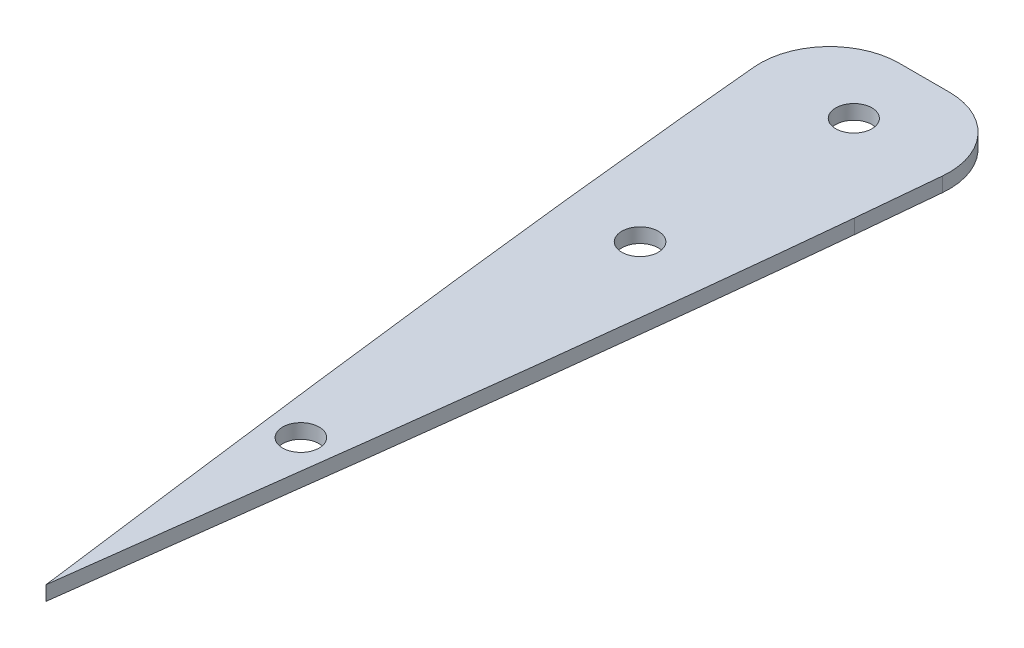
ISO-10303-21;
HEADER;
FILE_DESCRIPTION(('STEP AP214'),'2;1');
FILE_NAME('part.step','',(''),(''),'','','');
FILE_SCHEMA(('AUTOMOTIVE_DESIGN { 1 0 10303 214 1 1 1 1 }'));
ENDSEC;
DATA;
#1=APPLICATION_CONTEXT('core data for automotive mechanical design processes');
#2=APPLICATION_PROTOCOL_DEFINITION('international standard','automotive_design',2000,#1);
#3=PRODUCT_CONTEXT('',#1,'mechanical');
#4=PRODUCT('Part','Part','',(#3));
#5=PRODUCT_RELATED_PRODUCT_CATEGORY('part','',(#4));
#6=PRODUCT_DEFINITION_FORMATION('','',#4);
#7=PRODUCT_DEFINITION_CONTEXT('part definition',#1,'design');
#8=PRODUCT_DEFINITION('design','',#6,#7);
#9=PRODUCT_DEFINITION_SHAPE('','',#8);
#10=(LENGTH_UNIT() NAMED_UNIT(*) SI_UNIT(.MILLI.,.METRE.));
#11=(NAMED_UNIT(*) PLANE_ANGLE_UNIT() SI_UNIT($,.RADIAN.));
#12=(NAMED_UNIT(*) SI_UNIT($,.STERADIAN.) SOLID_ANGLE_UNIT());
#13=UNCERTAINTY_MEASURE_WITH_UNIT(LENGTH_MEASURE(1.E-05),#10,'distance_accuracy_value','');
#14=(GEOMETRIC_REPRESENTATION_CONTEXT(3) GLOBAL_UNCERTAINTY_ASSIGNED_CONTEXT((#13)) GLOBAL_UNIT_ASSIGNED_CONTEXT((#10,
#11,#12)) REPRESENTATION_CONTEXT('',''));
#15=CARTESIAN_POINT('',(0.,0.,0.));
#16=DIRECTION('',(0.,0.,1.));
#17=DIRECTION('',(1.,0.,0.));
#18=AXIS2_PLACEMENT_3D('',#15,#16,#17);
#19=CARTESIAN_POINT('',(1.10809611059364,169.87266,71.9337783562964));
#20=DIRECTION('',(0.,-1.,0.));
#21=DIRECTION('',(0.,0.,-1.));
#22=AXIS2_PLACEMENT_3D('',#19,#20,#21);
#23=CYLINDRICAL_SURFACE('',#22,2.);
#24=CARTESIAN_POINT('',(1.10809611059364,127.918597709814,71.9337783562964));
#25=DIRECTION('',(0.,1.,0.));
#26=DIRECTION('',(0.,0.,1.));
#27=AXIS2_PLACEMENT_3D('',#24,#25,#26);
#28=CIRCLE('',#27,2.);
#29=CARTESIAN_POINT('',(1.10809611059364,127.918597709814,73.9337783562964));
#30=VERTEX_POINT('',#29);
#31=EDGE_CURVE('E43',#30,#30,#28,.F.);
#32=ORIENTED_EDGE('',*,*,#31,.T.);
#33=EDGE_LOOP('',(#32));
#34=FACE_BOUND('',#33,.T.);
#35=CARTESIAN_POINT('',(1.10809611059364,129.506097709814,71.9337783562964));
#36=DIRECTION('',(0.,-1.,0.));
#37=DIRECTION('',(0.,0.,-1.));
#38=AXIS2_PLACEMENT_3D('',#35,#36,#37);
#39=CIRCLE('',#38,2.);
#40=CARTESIAN_POINT('',(1.10809611059364,129.506097709814,69.9337783562964));
#41=VERTEX_POINT('',#40);
#42=EDGE_CURVE('E131',#41,#41,#39,.F.);
#43=ORIENTED_EDGE('',*,*,#42,.T.);
#44=EDGE_LOOP('',(#43));
#45=FACE_BOUND('',#44,.T.);
#46=ADVANCED_FACE('F39',(#34,#45),#23,.F.);
#47=CARTESIAN_POINT('',(-9.25951888196291,129.506097709814,99.8737783562964));
#48=DIRECTION('',(0.,-1.,0.));
#49=DIRECTION('',(0.,0.,-1.));
#50=AXIS2_PLACEMENT_3D('',#47,#48,#49);
#51=PLANE('',#50);
#52=CARTESIAN_POINT('',(1.10810856874065,129.506097709814,11.326456678177));
#53=DIRECTION('',(0.,-1.,0.));
#54=DIRECTION('',(0.,0.,-1.));
#55=AXIS2_PLACEMENT_3D('',#52,#53,#54);
#56=CIRCLE('',#55,1.984375);
#57=CARTESIAN_POINT('',(1.10810856874065,129.506097709814,9.342081678177));
#58=VERTEX_POINT('',#57);
#59=EDGE_CURVE('E120',#58,#58,#56,.T.);
#60=ORIENTED_EDGE('',*,*,#59,.T.);
#61=EDGE_LOOP('',(#60));
#62=FACE_BOUND('',#61,.T.);
#63=CARTESIAN_POINT('',(-1.63951888196291,129.506097709814,11.2274515728352));
#64=DIRECTION('',(0.,-1.,0.));
#65=DIRECTION('',(0.,0.,-1.));
#66=AXIS2_PLACEMENT_3D('',#63,#64,#65);
#67=CIRCLE('',#66,7.62);
#68=CARTESIAN_POINT('',(-1.63951888196291,129.506097709814,3.60745157283523));
#69=VERTEX_POINT('',#68);
#70=CARTESIAN_POINT('',(-9.22789688315304,129.506097709814,11.9209350341043));
#71=VERTEX_POINT('',#70);
#72=EDGE_CURVE('E105',#69,#71,#67,.F.);
#73=ORIENTED_EDGE('',*,*,#72,.T.);
#74=CARTESIAN_POINT('',(-9.95528734648911,129.506097709814,3.60745157283523));
#75=CARTESIAN_POINT('',(-9.89780564985952,129.506097709814,4.29681695227936));
#76=CARTESIAN_POINT('',(-9.41437139557562,129.506097709814,10.0160031655518));
#77=CARTESIAN_POINT('',(-8.88377675291906,129.506097709814,15.7302015711882));
#78=CARTESIAN_POINT('',(-8.38670742850917,129.506097709814,20.7524515728352));
#79=B_SPLINE_CURVE_WITH_KNOTS('',3,(#74,#75,#76,#77,#78),.UNSPECIFIED.,.F.,.F.,(4,1,4),
(0.384969625903912,0.394992547848154,0.46813159331185),.UNSPECIFIED.);
#80=CARTESIAN_POINT('',(-8.38670742850917,129.506097709814,20.7524515728352));
#81=VERTEX_POINT('',#80);
#82=EDGE_CURVE('E121',#81,#71,#79,.F.);
#83=ORIENTED_EDGE('',*,*,#82,.F.);
#84=CARTESIAN_POINT('',(-8.38670742850917,129.506097709814,20.7524515728352));
#85=CARTESIAN_POINT('',(-5.77036767929202,129.506097709814,47.1872196515421));
#86=CARTESIAN_POINT('',(-2.31115252231645,129.506097709814,73.5317641629202));
#87=CARTESIAN_POINT('',(1.10809611059364,129.506097709814,99.8737783562964));
#88=B_SPLINE_CURVE_WITH_KNOTS('',3,(#84,#85,#86,#87),.UNSPECIFIED.,.F.,.F.,(4,4),(0.,
0.384969625903912),.UNSPECIFIED.);
#89=CARTESIAN_POINT('',(1.10809611059364,129.506097709814,99.8737783562964));
#90=VERTEX_POINT('',#89);
#91=EDGE_CURVE('E161',#90,#81,#88,.F.);
#92=ORIENTED_EDGE('',*,*,#91,.F.);
#93=CARTESIAN_POINT('',(1.10809611059364,129.506097709814,99.8737783562964));
#94=CARTESIAN_POINT('',(4.527344743513,129.506097709814,73.5317641629181));
#95=CARTESIAN_POINT('',(7.98655990047842,129.506097709814,47.1872196515431));
#96=CARTESIAN_POINT('',(10.6028996496958,129.506097709814,20.7524515728353));
#97=B_SPLINE_CURVE_WITH_KNOTS('',3,(#93,#94,#95,#96),.UNSPECIFIED.,.F.,.F.,(4,4),(0.,
0.384969625903911),.UNSPECIFIED.);
#98=CARTESIAN_POINT('',(10.6028996496958,129.506097709814,20.7524515728353));
#99=VERTEX_POINT('',#98);
#100=EDGE_CURVE('E152',#99,#90,#97,.F.);
#101=ORIENTED_EDGE('',*,*,#100,.F.);
#102=CARTESIAN_POINT('',(10.6028996496958,129.506097709814,20.7524515728353));
#103=CARTESIAN_POINT('',(11.0999689741058,129.506097709814,15.7302015711881));
#104=CARTESIAN_POINT('',(11.6305636167611,129.506097709814,10.0160031655713));
#105=CARTESIAN_POINT('',(12.113997871047,129.506097709814,4.29681695227809));
#106=CARTESIAN_POINT('',(12.1714795676765,129.506097709814,3.60745157283523));
#107=B_SPLINE_CURVE_WITH_KNOTS('',3,(#102,#103,#104,#105,#106),.UNSPECIFIED.,.F.,.F.,(4,1,4),
(0.384969625903911,0.458108671367609,0.468131593311824),.UNSPECIFIED.);
#108=CARTESIAN_POINT('',(11.4440891043401,129.506097709814,11.9209350341047));
#109=VERTEX_POINT('',#108);
#110=EDGE_CURVE('E146',#109,#99,#107,.F.);
#111=ORIENTED_EDGE('',*,*,#110,.F.);
#112=CARTESIAN_POINT('',(3.85571110314996,129.506097709814,11.2274515728352));
#113=DIRECTION('',(0.,-1.,0.));
#114=DIRECTION('',(0.,0.,-1.));
#115=AXIS2_PLACEMENT_3D('',#112,#113,#114);
#116=CIRCLE('',#115,7.62);
#117=CARTESIAN_POINT('',(3.85571110314996,129.506097709814,3.60745157283523));
#118=VERTEX_POINT('',#117);
#119=EDGE_CURVE('E108',#109,#118,#116,.F.);
#120=ORIENTED_EDGE('',*,*,#119,.T.);
#121=DIRECTION('',(1.,0.,0.));
#122=VECTOR('',#121,1.);
#123=CARTESIAN_POINT('',(-9.25951888196291,129.506097709814,3.60745157283523));
#124=LINE('',#123,#122);
#125=EDGE_CURVE('E101',#69,#118,#124,.T.);
#126=ORIENTED_EDGE('',*,*,#125,.F.);
#127=EDGE_LOOP('',(#73,#83,#92,#101,#111,#120,#126));
#128=FACE_BOUND('',#127,.T.);
#129=ORIENTED_EDGE('',*,*,#42,.F.);
#130=EDGE_LOOP('',(#129));
#131=FACE_BOUND('',#130,.T.);
#132=CARTESIAN_POINT('',(1.10809611059353,129.506097709814,34.7605521374388));
#133=DIRECTION('',(0.,-1.,0.));
#134=DIRECTION('',(0.,0.,-1.));
#135=AXIS2_PLACEMENT_3D('',#132,#133,#134);
#136=CIRCLE('',#135,2.);
#137=CARTESIAN_POINT('',(1.10809611059353,129.506097709814,32.7605521374388));
#138=VERTEX_POINT('',#137);
#139=EDGE_CURVE('E134',#138,#138,#136,.F.);
#140=ORIENTED_EDGE('',*,*,#139,.F.);
#141=EDGE_LOOP('',(#140));
#142=FACE_BOUND('',#141,.T.);
#143=ADVANCED_FACE('F103',(#62,#128,#131,#142),#51,.F.);
#144=CARTESIAN_POINT('',(-9.25951888196291,127.918597709814,99.8737783562964));
#145=DIRECTION('',(0.,1.,0.));
#146=DIRECTION('',(0.,0.,1.));
#147=AXIS2_PLACEMENT_3D('',#144,#145,#146);
#148=PLANE('',#147);
#149=CARTESIAN_POINT('',(1.10810856874065,127.918597709814,11.326456678177));
#150=DIRECTION('',(0.,1.,0.));
#151=DIRECTION('',(0.,0.,1.));
#152=AXIS2_PLACEMENT_3D('',#149,#150,#151);
#153=CIRCLE('',#152,1.984375);
#154=CARTESIAN_POINT('',(1.10810856874065,127.918597709814,13.310831678177));
#155=VERTEX_POINT('',#154);
#156=EDGE_CURVE('E225',#155,#155,#153,.T.);
#157=ORIENTED_EDGE('',*,*,#156,.T.);
#158=EDGE_LOOP('',(#157));
#159=FACE_BOUND('',#158,.T.);
#160=CARTESIAN_POINT('',(-1.63951888196291,127.918597709814,11.2274515728352));
#161=DIRECTION('',(0.,1.,0.));
#162=DIRECTION('',(0.,0.,1.));
#163=AXIS2_PLACEMENT_3D('',#160,#161,#162);
#164=CIRCLE('',#163,7.62);
#165=CARTESIAN_POINT('',(-9.22789688315304,127.918597709814,11.9209350341043));
#166=VERTEX_POINT('',#165);
#167=CARTESIAN_POINT('',(-1.63951888196291,127.918597709814,3.60745157283523));
#168=VERTEX_POINT('',#167);
#169=EDGE_CURVE('E57',#166,#168,#164,.F.);
#170=ORIENTED_EDGE('',*,*,#169,.T.);
#171=DIRECTION('',(1.,0.,0.));
#172=VECTOR('',#171,1.);
#173=CARTESIAN_POINT('',(-9.25951888196291,127.918597709814,3.60745157283523));
#174=LINE('',#173,#172);
#175=CARTESIAN_POINT('',(3.85571110314996,127.918597709814,3.60745157283523));
#176=VERTEX_POINT('',#175);
#177=EDGE_CURVE('E114',#168,#176,#174,.T.);
#178=ORIENTED_EDGE('',*,*,#177,.T.);
#179=CARTESIAN_POINT('',(3.85571110314996,127.918597709814,11.2274515728352));
#180=DIRECTION('',(0.,1.,0.));
#181=DIRECTION('',(0.,0.,1.));
#182=AXIS2_PLACEMENT_3D('',#179,#180,#181);
#183=CIRCLE('',#182,7.62);
#184=CARTESIAN_POINT('',(11.4440891043401,127.918597709814,11.9209350341047));
#185=VERTEX_POINT('',#184);
#186=EDGE_CURVE('E187',#176,#185,#183,.F.);
#187=ORIENTED_EDGE('',*,*,#186,.T.);
#188=CARTESIAN_POINT('',(10.6028996496958,127.918597709814,20.7524515728353));
#189=CARTESIAN_POINT('',(11.0999689741058,127.918597709814,15.7302015711881));
#190=CARTESIAN_POINT('',(11.6305636167611,127.918597709814,10.0160031655713));
#191=CARTESIAN_POINT('',(12.113997871047,127.918597709814,4.29681695227809));
#192=CARTESIAN_POINT('',(12.1714795676765,127.918597709814,3.60745157283523));
#193=B_SPLINE_CURVE_WITH_KNOTS('',3,(#188,#189,#190,#191,#192),.UNSPECIFIED.,.F.,.F.,(4,1,4),
(0.384969625903911,0.458108671367609,0.468131593311824),.UNSPECIFIED.);
#194=CARTESIAN_POINT('',(10.6028996496958,127.918597709814,20.7524515728353));
#195=VERTEX_POINT('',#194);
#196=EDGE_CURVE('E190',#195,#185,#193,.T.);
#197=ORIENTED_EDGE('',*,*,#196,.F.);
#198=CARTESIAN_POINT('',(1.10809611059364,127.918597709814,99.8737783562964));
#199=CARTESIAN_POINT('',(4.527344743513,127.918597709814,73.5317641629181));
#200=CARTESIAN_POINT('',(7.98655990047842,127.918597709814,47.1872196515431));
#201=CARTESIAN_POINT('',(10.6028996496958,127.918597709814,20.7524515728353));
#202=B_SPLINE_CURVE_WITH_KNOTS('',3,(#198,#199,#200,#201),.UNSPECIFIED.,.F.,.F.,(4,4),(0.,
0.384969625903911),.UNSPECIFIED.);
#203=CARTESIAN_POINT('',(1.10809611059364,127.918597709814,99.8737783562964));
#204=VERTEX_POINT('',#203);
#205=EDGE_CURVE('E196',#204,#195,#202,.T.);
#206=ORIENTED_EDGE('',*,*,#205,.F.);
#207=CARTESIAN_POINT('',(-8.38670742850917,127.918597709814,20.7524515728352));
#208=CARTESIAN_POINT('',(-5.77036767929202,127.918597709814,47.1872196515421));
#209=CARTESIAN_POINT('',(-2.31115252231645,127.918597709814,73.5317641629202));
#210=CARTESIAN_POINT('',(1.10809611059364,127.918597709814,99.8737783562964));
#211=B_SPLINE_CURVE_WITH_KNOTS('',3,(#207,#208,#209,#210),.UNSPECIFIED.,.F.,.F.,(4,4),(0.,
0.384969625903912),.UNSPECIFIED.);
#212=CARTESIAN_POINT('',(-8.38670742850917,127.918597709814,20.7524515728352));
#213=VERTEX_POINT('',#212);
#214=EDGE_CURVE('E64',#213,#204,#211,.T.);
#215=ORIENTED_EDGE('',*,*,#214,.F.);
#216=CARTESIAN_POINT('',(-9.95528734648911,127.918597709814,3.60745157283523));
#217=CARTESIAN_POINT('',(-9.89780564985952,127.918597709814,4.29681695227936));
#218=CARTESIAN_POINT('',(-9.41437139557562,127.918597709814,10.0160031655518));
#219=CARTESIAN_POINT('',(-8.88377675291906,127.918597709814,15.7302015711882));
#220=CARTESIAN_POINT('',(-8.38670742850917,127.918597709814,20.7524515728352));
#221=B_SPLINE_CURVE_WITH_KNOTS('',3,(#216,#217,#218,#219,#220),.UNSPECIFIED.,.F.,.F.,(4,1,4),
(0.384969625903912,0.394992547848154,0.46813159331185),.UNSPECIFIED.);
#222=EDGE_CURVE('E212',#166,#213,#221,.T.);
#223=ORIENTED_EDGE('',*,*,#222,.F.);
#224=EDGE_LOOP('',(#170,#178,#187,#197,#206,#215,#223));
#225=FACE_BOUND('',#224,.T.);
#226=ORIENTED_EDGE('',*,*,#31,.F.);
#227=EDGE_LOOP('',(#226));
#228=FACE_BOUND('',#227,.T.);
#229=CARTESIAN_POINT('',(1.10809611059353,127.918597709814,34.7605521374388));
#230=DIRECTION('',(0.,1.,0.));
#231=DIRECTION('',(0.,0.,1.));
#232=AXIS2_PLACEMENT_3D('',#229,#230,#231);
#233=CIRCLE('',#232,2.);
#234=CARTESIAN_POINT('',(1.10809611059353,127.918597709814,36.7605521374388));
#235=VERTEX_POINT('',#234);
#236=EDGE_CURVE('E183',#235,#235,#233,.F.);
#237=ORIENTED_EDGE('',*,*,#236,.F.);
#238=EDGE_LOOP('',(#237));
#239=FACE_BOUND('',#238,.T.);
#240=ADVANCED_FACE('F261',(#159,#225,#228,#239),#148,.F.);
#241=CARTESIAN_POINT('',(1.10809611059353,169.87266,34.7605521374388));
#242=DIRECTION('',(0.,-1.,0.));
#243=DIRECTION('',(0.,0.,-1.));
#244=AXIS2_PLACEMENT_3D('',#241,#242,#243);
#245=CYLINDRICAL_SURFACE('',#244,2.);
#246=ORIENTED_EDGE('',*,*,#236,.T.);
#247=EDGE_LOOP('',(#246));
#248=FACE_BOUND('',#247,.T.);
#249=ORIENTED_EDGE('',*,*,#139,.T.);
#250=EDGE_LOOP('',(#249));
#251=FACE_BOUND('',#250,.T.);
#252=ADVANCED_FACE('F267',(#248,#251),#245,.F.);
#253=CARTESIAN_POINT('',(1.10809611059364,169.87266,99.8737783562964));
#254=CARTESIAN_POINT('',(4.527344743513,169.87266,73.5317641629181));
#255=CARTESIAN_POINT('',(7.98655990047842,169.87266,47.1872196515431));
#256=CARTESIAN_POINT('',(10.6028996496958,169.87266,20.7524515728353));
#257=B_SPLINE_CURVE_WITH_KNOTS('',3,(#253,#254,#255,#256),.UNSPECIFIED.,.F.,.F.,(4,4),(0.,
0.384969625903911),.UNSPECIFIED.);
#258=DIRECTION('',(0.,-1.,0.));
#259=VECTOR('',#258,1.);
#260=SURFACE_OF_LINEAR_EXTRUSION('',#257,#259);
#261=DIRECTION('',(0.,-1.,0.));
#262=VECTOR('',#261,1.);
#263=CARTESIAN_POINT('',(1.10809611059364,169.87266,99.8737783562964));
#264=LINE('',#263,#262);
#265=EDGE_CURVE('E294',#90,#204,#264,.T.);
#266=ORIENTED_EDGE('',*,*,#265,.T.);
#267=ORIENTED_EDGE('',*,*,#205,.T.);
#268=DIRECTION('',(0.,-1.,0.));
#269=VECTOR('',#268,1.);
#270=CARTESIAN_POINT('',(10.6028996496958,169.87266,20.7524515728353));
#271=LINE('',#270,#269);
#272=EDGE_CURVE('E290',#99,#195,#271,.T.);
#273=ORIENTED_EDGE('',*,*,#272,.F.);
#274=ORIENTED_EDGE('',*,*,#100,.T.);
#275=EDGE_LOOP('',(#266,#267,#273,#274));
#276=FACE_BOUND('',#275,.T.);
#277=ADVANCED_FACE('F245',(#276),#260,.F.);
#278=CARTESIAN_POINT('',(-8.38670742850917,169.87266,20.7524515728352));
#279=CARTESIAN_POINT('',(-5.77036767929202,169.87266,47.1872196515421));
#280=CARTESIAN_POINT('',(-2.31115252231645,169.87266,73.5317641629202));
#281=CARTESIAN_POINT('',(1.10809611059364,169.87266,99.8737783562964));
#282=B_SPLINE_CURVE_WITH_KNOTS('',3,(#278,#279,#280,#281),.UNSPECIFIED.,.F.,.F.,(4,4),(0.,
0.384969625903912),.UNSPECIFIED.);
#283=DIRECTION('',(0.,-1.,0.));
#284=VECTOR('',#283,1.);
#285=SURFACE_OF_LINEAR_EXTRUSION('',#282,#284);
#286=DIRECTION('',(0.,-1.,0.));
#287=VECTOR('',#286,1.);
#288=CARTESIAN_POINT('',(-8.38670742850917,169.87266,20.7524515728352));
#289=LINE('',#288,#287);
#290=EDGE_CURVE('E229',#81,#213,#289,.T.);
#291=ORIENTED_EDGE('',*,*,#290,.T.);
#292=ORIENTED_EDGE('',*,*,#214,.T.);
#293=ORIENTED_EDGE('',*,*,#265,.F.);
#294=ORIENTED_EDGE('',*,*,#91,.T.);
#295=EDGE_LOOP('',(#291,#292,#293,#294));
#296=FACE_BOUND('',#295,.T.);
#297=ADVANCED_FACE('F242',(#296),#285,.F.);
#298=CARTESIAN_POINT('',(-1.63951888196291,84.93633,11.2274515728352));
#299=DIRECTION('',(0.,-1.,0.));
#300=DIRECTION('',(0.,0.,-1.));
#301=AXIS2_PLACEMENT_3D('',#298,#299,#300);
#302=CYLINDRICAL_SURFACE('',#301,7.62);
#303=ORIENTED_EDGE('',*,*,#169,.F.);
#304=DIRECTION('',(0.,-1.,0.));
#305=VECTOR('',#304,1.);
#306=CARTESIAN_POINT('',(-9.22789688315304,146.81454,11.9209350341043));
#307=LINE('',#306,#305);
#308=EDGE_CURVE('E118',#71,#166,#307,.T.);
#309=ORIENTED_EDGE('',*,*,#308,.F.);
#310=ORIENTED_EDGE('',*,*,#72,.F.);
#311=DIRECTION('',(0.,-1.,0.));
#312=VECTOR('',#311,1.);
#313=CARTESIAN_POINT('',(-1.63951888196291,169.87266,3.60745157283523));
#314=LINE('',#313,#312);
#315=EDGE_CURVE('E49',#168,#69,#314,.F.);
#316=ORIENTED_EDGE('',*,*,#315,.F.);
#317=EDGE_LOOP('',(#303,#309,#310,#316));
#318=FACE_BOUND('',#317,.T.);
#319=ADVANCED_FACE('F116',(#318),#302,.T.);
#320=CARTESIAN_POINT('',(-9.95528734648911,169.87266,3.60745157283523));
#321=CARTESIAN_POINT('',(-9.89780564985952,169.87266,4.29681695227936));
#322=CARTESIAN_POINT('',(-9.41437139557562,169.87266,10.0160031655518));
#323=CARTESIAN_POINT('',(-8.88377675291906,169.87266,15.7302015711882));
#324=CARTESIAN_POINT('',(-8.38670742850917,169.87266,20.7524515728352));
#325=B_SPLINE_CURVE_WITH_KNOTS('',3,(#320,#321,#322,#323,#324),.UNSPECIFIED.,.F.,.F.,(4,1,4),
(0.384969625903912,0.394992547848154,0.46813159331185),.UNSPECIFIED.);
#326=DIRECTION('',(0.,-1.,0.));
#327=VECTOR('',#326,1.);
#328=SURFACE_OF_LINEAR_EXTRUSION('',#325,#327);
#329=ORIENTED_EDGE('',*,*,#308,.T.);
#330=ORIENTED_EDGE('',*,*,#222,.T.);
#331=ORIENTED_EDGE('',*,*,#290,.F.);
#332=ORIENTED_EDGE('',*,*,#82,.T.);
#333=EDGE_LOOP('',(#329,#330,#331,#332));
#334=FACE_BOUND('',#333,.T.);
#335=ADVANCED_FACE('F249',(#334),#328,.F.);
#336=CARTESIAN_POINT('',(3.85571110314996,84.93633,11.2274515728352));
#337=DIRECTION('',(0.,-1.,0.));
#338=DIRECTION('',(0.,0.,-1.));
#339=AXIS2_PLACEMENT_3D('',#336,#337,#338);
#340=CYLINDRICAL_SURFACE('',#339,7.62);
#341=ORIENTED_EDGE('',*,*,#186,.F.);
#342=DIRECTION('',(0.,-1.,0.));
#343=VECTOR('',#342,1.);
#344=CARTESIAN_POINT('',(3.85571110314996,169.87266,3.60745157283523));
#345=LINE('',#344,#343);
#346=EDGE_CURVE('E126',#118,#176,#345,.T.);
#347=ORIENTED_EDGE('',*,*,#346,.F.);
#348=ORIENTED_EDGE('',*,*,#119,.F.);
#349=DIRECTION('',(0.,-1.,0.));
#350=VECTOR('',#349,1.);
#351=CARTESIAN_POINT('',(11.4440891043401,23.05812,11.9209350341047));
#352=LINE('',#351,#350);
#353=EDGE_CURVE('E11',#185,#109,#352,.F.);
#354=ORIENTED_EDGE('',*,*,#353,.F.);
#355=EDGE_LOOP('',(#341,#347,#348,#354));
#356=FACE_BOUND('',#355,.T.);
#357=ADVANCED_FACE('F41',(#356),#340,.T.);
#358=CARTESIAN_POINT('',(-9.95528734648911,169.87266,3.60745157283523));
#359=DIRECTION('',(0.,0.,1.));
#360=DIRECTION('',(1.,0.,0.));
#361=AXIS2_PLACEMENT_3D('',#358,#359,#360);
#362=PLANE('',#361);
#363=ORIENTED_EDGE('',*,*,#346,.T.);
#364=ORIENTED_EDGE('',*,*,#177,.F.);
#365=ORIENTED_EDGE('',*,*,#315,.T.);
#366=ORIENTED_EDGE('',*,*,#125,.T.);
#367=EDGE_LOOP('',(#363,#364,#365,#366));
#368=FACE_BOUND('',#367,.T.);
#369=ADVANCED_FACE('F124',(#368),#362,.F.);
#370=CARTESIAN_POINT('',(10.6028996496958,169.87266,20.7524515728353));
#371=CARTESIAN_POINT('',(11.0999689741058,169.87266,15.7302015711881));
#372=CARTESIAN_POINT('',(11.6305636167611,169.87266,10.0160031655713));
#373=CARTESIAN_POINT('',(12.113997871047,169.87266,4.29681695227809));
#374=CARTESIAN_POINT('',(12.1714795676765,169.87266,3.60745157283523));
#375=B_SPLINE_CURVE_WITH_KNOTS('',3,(#370,#371,#372,#373,#374),.UNSPECIFIED.,.F.,.F.,(4,1,4),
(0.384969625903911,0.458108671367609,0.468131593311824),.UNSPECIFIED.);
#376=DIRECTION('',(0.,-1.,0.));
#377=VECTOR('',#376,1.);
#378=SURFACE_OF_LINEAR_EXTRUSION('',#375,#377);
#379=ORIENTED_EDGE('',*,*,#272,.T.);
#380=ORIENTED_EDGE('',*,*,#196,.T.);
#381=ORIENTED_EDGE('',*,*,#353,.T.);
#382=ORIENTED_EDGE('',*,*,#110,.T.);
#383=EDGE_LOOP('',(#379,#380,#381,#382));
#384=FACE_BOUND('',#383,.T.);
#385=ADVANCED_FACE('F273',(#384),#378,.F.);
#386=CARTESIAN_POINT('',(1.10810856874065,169.87266,11.326456678177));
#387=DIRECTION('',(0.,-1.,0.));
#388=DIRECTION('',(0.,0.,-1.));
#389=AXIS2_PLACEMENT_3D('',#386,#387,#388);
#390=CYLINDRICAL_SURFACE('',#389,1.984375);
#391=ORIENTED_EDGE('',*,*,#156,.F.);
#392=EDGE_LOOP('',(#391));
#393=FACE_BOUND('',#392,.T.);
#394=ORIENTED_EDGE('',*,*,#59,.F.);
#395=EDGE_LOOP('',(#394));
#396=FACE_BOUND('',#395,.T.);
#397=ADVANCED_FACE('F271',(#393,#396),#390,.F.);
#398=CLOSED_SHELL('',(#46,#143,#240,#252,#277,#297,#319,#335,#357,#369,#385,#397));
#399=MANIFOLD_SOLID_BREP('B2',#398);
#400=ADVANCED_BREP_SHAPE_REPRESENTATION('',(#18,#399),#14);
#401=SHAPE_DEFINITION_REPRESENTATION(#9,#400);
ENDSEC;
END-ISO-10303-21;
